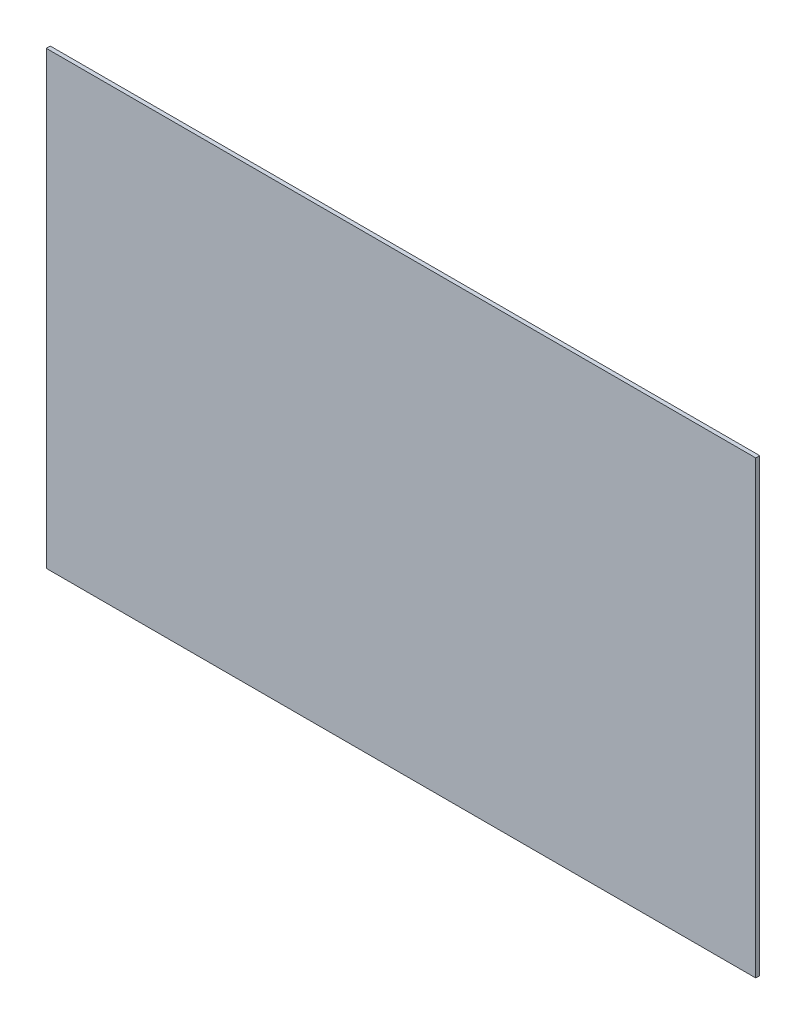
ISO-10303-21;
HEADER;
FILE_DESCRIPTION(('STEP AP214'),'2;1');
FILE_NAME('part.step','',(''),(''),'','','');
FILE_SCHEMA(('AUTOMOTIVE_DESIGN { 1 0 10303 214 1 1 1 1 }'));
ENDSEC;
DATA;
#1=APPLICATION_CONTEXT('core data for automotive mechanical design processes');
#2=APPLICATION_PROTOCOL_DEFINITION('international standard','automotive_design',2000,#1);
#3=PRODUCT_CONTEXT('',#1,'mechanical');
#4=PRODUCT('Part','Part','',(#3));
#5=PRODUCT_RELATED_PRODUCT_CATEGORY('part','',(#4));
#6=PRODUCT_DEFINITION_FORMATION('','',#4);
#7=PRODUCT_DEFINITION_CONTEXT('part definition',#1,'design');
#8=PRODUCT_DEFINITION('design','',#6,#7);
#9=PRODUCT_DEFINITION_SHAPE('','',#8);
#10=(LENGTH_UNIT() NAMED_UNIT(*) SI_UNIT(.MILLI.,.METRE.));
#11=(NAMED_UNIT(*) PLANE_ANGLE_UNIT() SI_UNIT($,.RADIAN.));
#12=(NAMED_UNIT(*) SI_UNIT($,.STERADIAN.) SOLID_ANGLE_UNIT());
#13=UNCERTAINTY_MEASURE_WITH_UNIT(LENGTH_MEASURE(1.E-05),#10,'distance_accuracy_value','');
#14=(GEOMETRIC_REPRESENTATION_CONTEXT(3) GLOBAL_UNCERTAINTY_ASSIGNED_CONTEXT((#13)) GLOBAL_UNIT_ASSIGNED_CONTEXT((#10,
#11,#12)) REPRESENTATION_CONTEXT('',''));
#15=CARTESIAN_POINT('',(0.,0.,0.));
#16=DIRECTION('',(0.,0.,1.));
#17=DIRECTION('',(1.,0.,0.));
#18=AXIS2_PLACEMENT_3D('',#15,#16,#17);
#19=CARTESIAN_POINT('',(-146.340932523771,96.5423101611668,1.));
#20=DIRECTION('',(1.,0.,0.));
#21=DIRECTION('',(0.,0.,-1.));
#22=AXIS2_PLACEMENT_3D('',#19,#20,#21);
#23=PLANE('',#22);
#24=DIRECTION('',(0.,-1.,0.));
#25=VECTOR('',#24,1.);
#26=CARTESIAN_POINT('',(-146.340932523771,96.5423101611668,0.));
#27=LINE('',#26,#25);
#28=CARTESIAN_POINT('',(-146.340932523771,96.5423101611668,0.));
#29=VERTEX_POINT('',#28);
#30=CARTESIAN_POINT('',(-146.340932523771,-16.4576898388332,0.));
#31=VERTEX_POINT('',#30);
#32=EDGE_CURVE('E98',#29,#31,#27,.T.);
#33=ORIENTED_EDGE('',*,*,#32,.T.);
#34=DIRECTION('',(0.,0.,-1.));
#35=VECTOR('',#34,1.);
#36=CARTESIAN_POINT('',(-146.340932523771,-16.4576898388332,1.));
#37=LINE('',#36,#35);
#38=CARTESIAN_POINT('',(-146.340932523771,-16.4576898388332,1.));
#39=VERTEX_POINT('',#38);
#40=EDGE_CURVE('E11',#39,#31,#37,.T.);
#41=ORIENTED_EDGE('',*,*,#40,.F.);
#42=DIRECTION('',(0.,-1.,0.));
#43=VECTOR('',#42,1.);
#44=CARTESIAN_POINT('',(-146.340932523771,96.5423101611668,1.));
#45=LINE('',#44,#43);
#46=CARTESIAN_POINT('',(-146.340932523771,96.5423101611668,1.));
#47=VERTEX_POINT('',#46);
#48=EDGE_CURVE('E86',#47,#39,#45,.T.);
#49=ORIENTED_EDGE('',*,*,#48,.F.);
#50=DIRECTION('',(0.,0.,-1.));
#51=VECTOR('',#50,1.);
#52=CARTESIAN_POINT('',(-146.340932523771,96.5423101611668,1.));
#53=LINE('',#52,#51);
#54=EDGE_CURVE('E94',#47,#29,#53,.T.);
#55=ORIENTED_EDGE('',*,*,#54,.T.);
#56=EDGE_LOOP('',(#33,#41,#49,#55));
#57=FACE_BOUND('',#56,.T.);
#58=ADVANCED_FACE('F35',(#57),#23,.F.);
#59=CARTESIAN_POINT('',(-146.340932523771,-16.4576898388332,1.));
#60=DIRECTION('',(0.,1.,0.));
#61=DIRECTION('',(0.,0.,1.));
#62=AXIS2_PLACEMENT_3D('',#59,#60,#61);
#63=PLANE('',#62);
#64=DIRECTION('',(1.,0.,0.));
#65=VECTOR('',#64,1.);
#66=CARTESIAN_POINT('',(-146.340932523771,-16.4576898388332,0.));
#67=LINE('',#66,#65);
#68=CARTESIAN_POINT('',(31.6590674762287,-16.4576898388332,0.));
#69=VERTEX_POINT('',#68);
#70=EDGE_CURVE('E90',#31,#69,#67,.T.);
#71=ORIENTED_EDGE('',*,*,#70,.T.);
#72=DIRECTION('',(0.,0.,-1.));
#73=VECTOR('',#72,1.);
#74=CARTESIAN_POINT('',(31.6590674762287,-16.4576898388332,1.));
#75=LINE('',#74,#73);
#76=CARTESIAN_POINT('',(31.6590674762287,-16.4576898388332,1.));
#77=VERTEX_POINT('',#76);
#78=EDGE_CURVE('E43',#77,#69,#75,.T.);
#79=ORIENTED_EDGE('',*,*,#78,.F.);
#80=DIRECTION('',(1.,0.,0.));
#81=VECTOR('',#80,1.);
#82=CARTESIAN_POINT('',(-146.340932523771,-16.4576898388332,1.));
#83=LINE('',#82,#81);
#84=EDGE_CURVE('E81',#39,#77,#83,.T.);
#85=ORIENTED_EDGE('',*,*,#84,.F.);
#86=ORIENTED_EDGE('',*,*,#40,.T.);
#87=EDGE_LOOP('',(#71,#79,#85,#86));
#88=FACE_BOUND('',#87,.T.);
#89=ADVANCED_FACE('F89',(#88),#63,.F.);
#90=CARTESIAN_POINT('',(31.6590674762286,96.5423101611668,1.));
#91=DIRECTION('',(-1.,0.,0.));
#92=DIRECTION('',(0.,-1.,0.));
#93=AXIS2_PLACEMENT_3D('',#90,#91,#92);
#94=PLANE('',#93);
#95=DIRECTION('',(0.,1.,0.));
#96=VECTOR('',#95,1.);
#97=CARTESIAN_POINT('',(31.6590674762286,96.5423101611668,0.));
#98=LINE('',#97,#96);
#99=CARTESIAN_POINT('',(31.6590674762286,96.5423101611668,0.));
#100=VERTEX_POINT('',#99);
#101=EDGE_CURVE('E68',#69,#100,#98,.T.);
#102=ORIENTED_EDGE('',*,*,#101,.T.);
#103=DIRECTION('',(0.,0.,-1.));
#104=VECTOR('',#103,1.);
#105=CARTESIAN_POINT('',(31.6590674762286,96.5423101611668,1.));
#106=LINE('',#105,#104);
#107=CARTESIAN_POINT('',(31.6590674762286,96.5423101611668,1.));
#108=VERTEX_POINT('',#107);
#109=EDGE_CURVE('E91',#108,#100,#106,.T.);
#110=ORIENTED_EDGE('',*,*,#109,.F.);
#111=DIRECTION('',(0.,1.,0.));
#112=VECTOR('',#111,1.);
#113=CARTESIAN_POINT('',(31.6590674762286,96.5423101611668,1.));
#114=LINE('',#113,#112);
#115=EDGE_CURVE('E84',#77,#108,#114,.T.);
#116=ORIENTED_EDGE('',*,*,#115,.F.);
#117=ORIENTED_EDGE('',*,*,#78,.T.);
#118=EDGE_LOOP('',(#102,#110,#116,#117));
#119=FACE_BOUND('',#118,.T.);
#120=ADVANCED_FACE('F92',(#119),#94,.F.);
#121=CARTESIAN_POINT('',(-146.340932523771,96.5423101611668,1.));
#122=DIRECTION('',(0.,-1.,0.));
#123=DIRECTION('',(0.,0.,-1.));
#124=AXIS2_PLACEMENT_3D('',#121,#122,#123);
#125=PLANE('',#124);
#126=DIRECTION('',(-1.,0.,0.));
#127=VECTOR('',#126,1.);
#128=CARTESIAN_POINT('',(-146.340932523771,96.5423101611668,0.));
#129=LINE('',#128,#127);
#130=EDGE_CURVE('E74',#100,#29,#129,.T.);
#131=ORIENTED_EDGE('',*,*,#130,.T.);
#132=ORIENTED_EDGE('',*,*,#54,.F.);
#133=DIRECTION('',(-1.,0.,0.));
#134=VECTOR('',#133,1.);
#135=CARTESIAN_POINT('',(-146.340932523771,96.5423101611668,1.));
#136=LINE('',#135,#134);
#137=EDGE_CURVE('E51',#108,#47,#136,.T.);
#138=ORIENTED_EDGE('',*,*,#137,.F.);
#139=ORIENTED_EDGE('',*,*,#109,.T.);
#140=EDGE_LOOP('',(#131,#132,#138,#139));
#141=FACE_BOUND('',#140,.T.);
#142=ADVANCED_FACE('F105',(#141),#125,.F.);
#143=CARTESIAN_POINT('',(0.,0.,1.));
#144=DIRECTION('',(0.,0.,1.));
#145=DIRECTION('',(1.,0.,0.));
#146=AXIS2_PLACEMENT_3D('',#143,#144,#145);
#147=PLANE('',#146);
#148=ORIENTED_EDGE('',*,*,#48,.T.);
#149=ORIENTED_EDGE('',*,*,#84,.T.);
#150=ORIENTED_EDGE('',*,*,#115,.T.);
#151=ORIENTED_EDGE('',*,*,#137,.T.);
#152=EDGE_LOOP('',(#148,#149,#150,#151));
#153=FACE_BOUND('',#152,.T.);
#154=ADVANCED_FACE('F82',(#153),#147,.T.);
#155=CARTESIAN_POINT('',(0.,0.,0.));
#156=DIRECTION('',(0.,0.,1.));
#157=DIRECTION('',(1.,0.,0.));
#158=AXIS2_PLACEMENT_3D('',#155,#156,#157);
#159=PLANE('',#158);
#160=ORIENTED_EDGE('',*,*,#32,.F.);
#161=ORIENTED_EDGE('',*,*,#130,.F.);
#162=ORIENTED_EDGE('',*,*,#101,.F.);
#163=ORIENTED_EDGE('',*,*,#70,.F.);
#164=EDGE_LOOP('',(#160,#161,#162,#163));
#165=FACE_BOUND('',#164,.T.);
#166=ADVANCED_FACE('F108',(#165),#159,.F.);
#167=CLOSED_SHELL('',(#58,#89,#120,#142,#154,#166));
#168=MANIFOLD_SOLID_BREP('B2',#167);
#169=ADVANCED_BREP_SHAPE_REPRESENTATION('',(#18,#168),#14);
#170=SHAPE_DEFINITION_REPRESENTATION(#9,#169);
ENDSEC;
END-ISO-10303-21;
